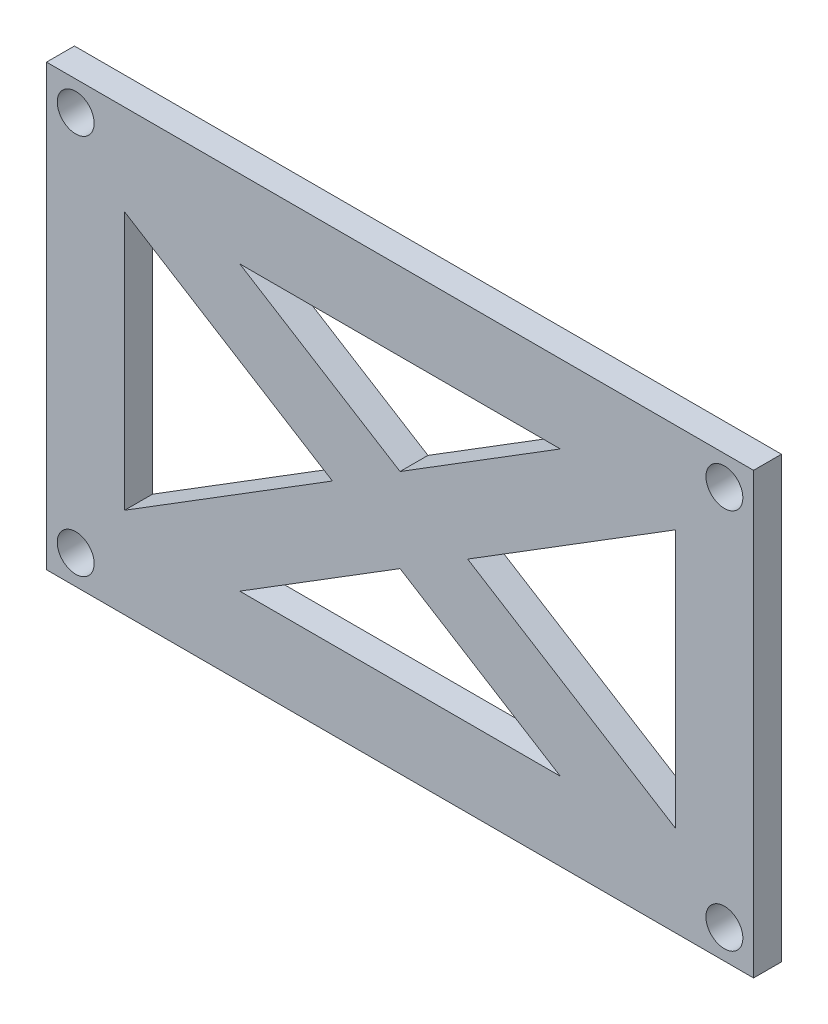
ISO-10303-21;
HEADER;
FILE_DESCRIPTION(('STEP AP214'),'2;1');
FILE_NAME('part.step','',(''),(''),'','','');
FILE_SCHEMA(('AUTOMOTIVE_DESIGN { 1 0 10303 214 1 1 1 1 }'));
ENDSEC;
DATA;
#1=APPLICATION_CONTEXT('core data for automotive mechanical design processes');
#2=APPLICATION_PROTOCOL_DEFINITION('international standard','automotive_design',2000,#1);
#3=PRODUCT_CONTEXT('',#1,'mechanical');
#4=PRODUCT('Part','Part','',(#3));
#5=PRODUCT_RELATED_PRODUCT_CATEGORY('part','',(#4));
#6=PRODUCT_DEFINITION_FORMATION('','',#4);
#7=PRODUCT_DEFINITION_CONTEXT('part definition',#1,'design');
#8=PRODUCT_DEFINITION('design','',#6,#7);
#9=PRODUCT_DEFINITION_SHAPE('','',#8);
#10=(LENGTH_UNIT() NAMED_UNIT(*) SI_UNIT(.MILLI.,.METRE.));
#11=(NAMED_UNIT(*) PLANE_ANGLE_UNIT() SI_UNIT($,.RADIAN.));
#12=(NAMED_UNIT(*) SI_UNIT($,.STERADIAN.) SOLID_ANGLE_UNIT());
#13=UNCERTAINTY_MEASURE_WITH_UNIT(LENGTH_MEASURE(1.E-05),#10,'distance_accuracy_value','');
#14=(GEOMETRIC_REPRESENTATION_CONTEXT(3) GLOBAL_UNCERTAINTY_ASSIGNED_CONTEXT((#13)) GLOBAL_UNIT_ASSIGNED_CONTEXT((#10,
#11,#12)) REPRESENTATION_CONTEXT('',''));
#15=CARTESIAN_POINT('',(0.,0.,0.));
#16=DIRECTION('',(0.,0.,1.));
#17=DIRECTION('',(1.,0.,0.));
#18=AXIS2_PLACEMENT_3D('',#15,#16,#17);
#19=CARTESIAN_POINT('',(-20.1168,-12.5095,1.5875));
#20=DIRECTION('',(0.,0.,-1.));
#21=DIRECTION('',(-1.,0.,0.));
#22=AXIS2_PLACEMENT_3D('',#19,#20,#21);
#23=PLANE('',#22);
#24=CARTESIAN_POINT('',(18.4568000000001,-10.8494999999998,1.5875));
#25=DIRECTION('',(0.,0.,1.));
#26=DIRECTION('',(1.,0.,0.));
#27=AXIS2_PLACEMENT_3D('',#24,#25,#26);
#28=CIRCLE('',#27,1.05);
#29=CARTESIAN_POINT('',(19.5068000000001,-10.8494999999998,1.5875));
#30=VERTEX_POINT('',#29);
#31=EDGE_CURVE('E397',#30,#30,#28,.T.);
#32=ORIENTED_EDGE('',*,*,#31,.F.);
#33=EDGE_LOOP('',(#32));
#34=FACE_BOUND('',#33,.T.);
#35=CARTESIAN_POINT('',(-18.4568,10.8495,1.5875));
#36=DIRECTION('',(0.,0.,1.));
#37=DIRECTION('',(1.,0.,0.));
#38=AXIS2_PLACEMENT_3D('',#35,#36,#37);
#39=CIRCLE('',#38,1.05);
#40=CARTESIAN_POINT('',(-17.4068,10.8495,1.5875));
#41=VERTEX_POINT('',#40);
#42=EDGE_CURVE('E169',#41,#41,#39,.T.);
#43=ORIENTED_EDGE('',*,*,#42,.F.);
#44=EDGE_LOOP('',(#43));
#45=FACE_BOUND('',#44,.T.);
#46=DIRECTION('',(1.,0.,0.));
#47=VECTOR('',#46,1.);
#48=CARTESIAN_POINT('',(9.12072361857965,-8.06450000000001,1.5875));
#49=LINE('',#48,#47);
#50=CARTESIAN_POINT('',(-9.12072361857965,-8.06450000000001,1.5875));
#51=VERTEX_POINT('',#50);
#52=CARTESIAN_POINT('',(9.12072361857965,-8.06450000000001,1.5875));
#53=VERTEX_POINT('',#52);
#54=EDGE_CURVE('E175',#51,#53,#49,.T.);
#55=ORIENTED_EDGE('',*,*,#54,.F.);
#56=DIRECTION('',(-0.849200858476322,-0.528069978282309,0.));
#57=VECTOR('',#56,1.);
#58=CARTESIAN_POINT('',(0.,-2.39283790132516,1.5875));
#59=LINE('',#58,#57);
#60=CARTESIAN_POINT('',(0.,-2.39283790132516,1.5875));
#61=VERTEX_POINT('',#60);
#62=EDGE_CURVE('E181',#61,#51,#59,.T.);
#63=ORIENTED_EDGE('',*,*,#62,.F.);
#64=DIRECTION('',(-0.849200858476322,0.528069978282309,0.));
#65=VECTOR('',#64,1.);
#66=CARTESIAN_POINT('',(9.12072361857965,-8.06450000000001,1.5875));
#67=LINE('',#66,#65);
#68=EDGE_CURVE('E177',#53,#61,#67,.T.);
#69=ORIENTED_EDGE('',*,*,#68,.F.);
#70=EDGE_LOOP('',(#55,#63,#69));
#71=FACE_BOUND('',#70,.T.);
#72=DIRECTION('',(0.849200858476322,-0.528069978282309,0.));
#73=VECTOR('',#72,1.);
#74=CARTESIAN_POINT('',(0.,2.39283790132515,1.5875));
#75=LINE('',#74,#73);
#76=CARTESIAN_POINT('',(-9.12072361857966,8.06449999999999,1.5875));
#77=VERTEX_POINT('',#76);
#78=CARTESIAN_POINT('',(0.,2.39283790132515,1.5875));
#79=VERTEX_POINT('',#78);
#80=EDGE_CURVE('E223',#77,#79,#75,.T.);
#81=ORIENTED_EDGE('',*,*,#80,.F.);
#82=DIRECTION('',(-1.,0.,0.));
#83=VECTOR('',#82,1.);
#84=CARTESIAN_POINT('',(9.12072361857965,8.0645,1.5875));
#85=LINE('',#84,#83);
#86=CARTESIAN_POINT('',(9.12072361857965,8.0645,1.5875));
#87=VERTEX_POINT('',#86);
#88=EDGE_CURVE('E229',#87,#77,#85,.T.);
#89=ORIENTED_EDGE('',*,*,#88,.F.);
#90=DIRECTION('',(0.849200858476322,0.528069978282309,0.));
#91=VECTOR('',#90,1.);
#92=CARTESIAN_POINT('',(9.12072361857965,8.0645,1.5875));
#93=LINE('',#92,#91);
#94=EDGE_CURVE('E225',#79,#87,#93,.T.);
#95=ORIENTED_EDGE('',*,*,#94,.F.);
#96=EDGE_LOOP('',(#81,#89,#95));
#97=FACE_BOUND('',#96,.T.);
#98=DIRECTION('',(0.,-1.,0.));
#99=VECTOR('',#98,1.);
#100=CARTESIAN_POINT('',(-20.1168,12.5095,1.5875));
#101=LINE('',#100,#99);
#102=CARTESIAN_POINT('',(-20.1168,12.5095,1.5875));
#103=VERTEX_POINT('',#102);
#104=CARTESIAN_POINT('',(-20.1168,-12.5095,1.5875));
#105=VERTEX_POINT('',#104);
#106=EDGE_CURVE('E247',#103,#105,#101,.T.);
#107=ORIENTED_EDGE('',*,*,#106,.T.);
#108=DIRECTION('',(1.,0.,0.));
#109=VECTOR('',#108,1.);
#110=CARTESIAN_POINT('',(20.1168,-12.5095,1.5875));
#111=LINE('',#110,#109);
#112=CARTESIAN_POINT('',(20.1168,-12.5095,1.5875));
#113=VERTEX_POINT('',#112);
#114=EDGE_CURVE('E250',#105,#113,#111,.T.);
#115=ORIENTED_EDGE('',*,*,#114,.T.);
#116=DIRECTION('',(0.,1.,0.));
#117=VECTOR('',#116,1.);
#118=CARTESIAN_POINT('',(20.1168,12.5095,1.5875));
#119=LINE('',#118,#117);
#120=CARTESIAN_POINT('',(20.1168,12.5095,1.5875));
#121=VERTEX_POINT('',#120);
#122=EDGE_CURVE('E253',#113,#121,#119,.T.);
#123=ORIENTED_EDGE('',*,*,#122,.T.);
#124=DIRECTION('',(-1.,0.,0.));
#125=VECTOR('',#124,1.);
#126=CARTESIAN_POINT('',(20.1168,12.5095,1.5875));
#127=LINE('',#126,#125);
#128=EDGE_CURVE('E255',#121,#103,#127,.T.);
#129=ORIENTED_EDGE('',*,*,#128,.T.);
#130=EDGE_LOOP('',(#107,#115,#123,#129));
#131=FACE_BOUND('',#130,.T.);
#132=DIRECTION('',(-0.849200858476322,0.528069978282308,0.));
#133=VECTOR('',#132,1.);
#134=CARTESIAN_POINT('',(-3.84797485857771,0.,1.5875));
#135=LINE('',#134,#133);
#136=CARTESIAN_POINT('',(-3.84797485857771,0.,1.5875));
#137=VERTEX_POINT('',#136);
#138=CARTESIAN_POINT('',(-15.6718,7.35256803301827,1.5875));
#139=VERTEX_POINT('',#138);
#140=EDGE_CURVE('E199',#137,#139,#135,.T.);
#141=ORIENTED_EDGE('',*,*,#140,.F.);
#142=DIRECTION('',(0.849200858476322,0.528069978282309,0.));
#143=VECTOR('',#142,1.);
#144=CARTESIAN_POINT('',(-3.84797485857771,0.,1.5875));
#145=LINE('',#144,#143);
#146=CARTESIAN_POINT('',(-15.6718,-7.35256803301829,1.5875));
#147=VERTEX_POINT('',#146);
#148=EDGE_CURVE('E205',#147,#137,#145,.T.);
#149=ORIENTED_EDGE('',*,*,#148,.F.);
#150=DIRECTION('',(0.,-1.,0.));
#151=VECTOR('',#150,1.);
#152=CARTESIAN_POINT('',(-15.6718,7.35256803301827,1.5875));
#153=LINE('',#152,#151);
#154=EDGE_CURVE('E201',#139,#147,#153,.T.);
#155=ORIENTED_EDGE('',*,*,#154,.F.);
#156=EDGE_LOOP('',(#141,#149,#155));
#157=FACE_BOUND('',#156,.T.);
#158=DIRECTION('',(0.,1.,0.));
#159=VECTOR('',#158,1.);
#160=CARTESIAN_POINT('',(15.6718,7.35256803301828,1.5875));
#161=LINE('',#160,#159);
#162=CARTESIAN_POINT('',(15.6718,-7.35256803301829,1.5875));
#163=VERTEX_POINT('',#162);
#164=CARTESIAN_POINT('',(15.6718,7.35256803301828,1.5875));
#165=VERTEX_POINT('',#164);
#166=EDGE_CURVE('E145',#163,#165,#161,.T.);
#167=ORIENTED_EDGE('',*,*,#166,.F.);
#168=DIRECTION('',(0.849200858476322,-0.528069978282308,0.));
#169=VECTOR('',#168,1.);
#170=CARTESIAN_POINT('',(15.6718,-7.35256803301829,1.5875));
#171=LINE('',#170,#169);
#172=CARTESIAN_POINT('',(3.84797485857771,0.,1.5875));
#173=VERTEX_POINT('',#172);
#174=EDGE_CURVE('E163',#173,#163,#171,.T.);
#175=ORIENTED_EDGE('',*,*,#174,.F.);
#176=DIRECTION('',(-0.849200858476322,-0.528069978282309,0.));
#177=VECTOR('',#176,1.);
#178=CARTESIAN_POINT('',(15.6718,7.35256803301828,1.5875));
#179=LINE('',#178,#177);
#180=EDGE_CURVE('E153',#165,#173,#179,.T.);
#181=ORIENTED_EDGE('',*,*,#180,.F.);
#182=EDGE_LOOP('',(#167,#175,#181));
#183=FACE_BOUND('',#182,.T.);
#184=CARTESIAN_POINT('',(-18.4568,-10.8495,1.5875));
#185=DIRECTION('',(0.,0.,1.));
#186=DIRECTION('',(-1.,0.,0.));
#187=AXIS2_PLACEMENT_3D('',#184,#185,#186);
#188=CIRCLE('',#187,1.05);
#189=CARTESIAN_POINT('',(-19.5068,-10.8495,1.5875));
#190=VERTEX_POINT('',#189);
#191=EDGE_CURVE('E403',#190,#190,#188,.T.);
#192=ORIENTED_EDGE('',*,*,#191,.F.);
#193=EDGE_LOOP('',(#192));
#194=FACE_BOUND('',#193,.T.);
#195=CARTESIAN_POINT('',(18.4567999999999,10.8495,1.5875));
#196=DIRECTION('',(0.,0.,1.));
#197=DIRECTION('',(-1.,0.,0.));
#198=AXIS2_PLACEMENT_3D('',#195,#196,#197);
#199=CIRCLE('',#198,1.05000000000001);
#200=CARTESIAN_POINT('',(17.4067999999999,10.8495,1.5875));
#201=VERTEX_POINT('',#200);
#202=EDGE_CURVE('E388',#201,#201,#199,.T.);
#203=ORIENTED_EDGE('',*,*,#202,.F.);
#204=EDGE_LOOP('',(#203));
#205=FACE_BOUND('',#204,.T.);
#206=ADVANCED_FACE('F32',(#34,#45,#71,#97,#131,#157,#183,#194,#205),#23,.F.);
#207=CARTESIAN_POINT('',(-20.1168,-12.5095,0.));
#208=DIRECTION('',(0.,0.,-1.));
#209=DIRECTION('',(-1.,0.,0.));
#210=AXIS2_PLACEMENT_3D('',#207,#208,#209);
#211=PLANE('',#210);
#212=CARTESIAN_POINT('',(18.4568000000001,-10.8494999999998,0.));
#213=DIRECTION('',(0.,0.,1.));
#214=DIRECTION('',(1.,0.,0.));
#215=AXIS2_PLACEMENT_3D('',#212,#213,#214);
#216=CIRCLE('',#215,1.05);
#217=CARTESIAN_POINT('',(19.5068000000001,-10.8494999999998,0.));
#218=VERTEX_POINT('',#217);
#219=EDGE_CURVE('E394',#218,#218,#216,.T.);
#220=ORIENTED_EDGE('',*,*,#219,.T.);
#221=EDGE_LOOP('',(#220));
#222=FACE_BOUND('',#221,.T.);
#223=CARTESIAN_POINT('',(-18.4568,10.8495,0.));
#224=DIRECTION('',(0.,0.,1.));
#225=DIRECTION('',(1.,0.,0.));
#226=AXIS2_PLACEMENT_3D('',#223,#224,#225);
#227=CIRCLE('',#226,1.05);
#228=CARTESIAN_POINT('',(-17.4068,10.8495,0.));
#229=VERTEX_POINT('',#228);
#230=EDGE_CURVE('E406',#229,#229,#227,.T.);
#231=ORIENTED_EDGE('',*,*,#230,.T.);
#232=EDGE_LOOP('',(#231));
#233=FACE_BOUND('',#232,.T.);
#234=DIRECTION('',(-0.849200858476322,-0.528069978282309,0.));
#235=VECTOR('',#234,1.);
#236=CARTESIAN_POINT('',(0.,-2.39283790132516,0.));
#237=LINE('',#236,#235);
#238=CARTESIAN_POINT('',(0.,-2.39283790132516,0.));
#239=VERTEX_POINT('',#238);
#240=CARTESIAN_POINT('',(-9.12072361857965,-8.06450000000001,0.));
#241=VERTEX_POINT('',#240);
#242=EDGE_CURVE('E178',#239,#241,#237,.T.);
#243=ORIENTED_EDGE('',*,*,#242,.T.);
#244=DIRECTION('',(1.,0.,0.));
#245=VECTOR('',#244,1.);
#246=CARTESIAN_POINT('',(9.12072361857965,-8.06450000000001,0.));
#247=LINE('',#246,#245);
#248=CARTESIAN_POINT('',(9.12072361857965,-8.06450000000001,0.));
#249=VERTEX_POINT('',#248);
#250=EDGE_CURVE('E160',#241,#249,#247,.T.);
#251=ORIENTED_EDGE('',*,*,#250,.T.);
#252=DIRECTION('',(-0.849200858476322,0.528069978282309,0.));
#253=VECTOR('',#252,1.);
#254=CARTESIAN_POINT('',(9.12072361857965,-8.06450000000001,0.));
#255=LINE('',#254,#253);
#256=EDGE_CURVE('E186',#249,#239,#255,.T.);
#257=ORIENTED_EDGE('',*,*,#256,.T.);
#258=EDGE_LOOP('',(#243,#251,#257));
#259=FACE_BOUND('',#258,.T.);
#260=DIRECTION('',(-1.,0.,0.));
#261=VECTOR('',#260,1.);
#262=CARTESIAN_POINT('',(9.12072361857965,8.0645,0.));
#263=LINE('',#262,#261);
#264=CARTESIAN_POINT('',(9.12072361857965,8.0645,0.));
#265=VERTEX_POINT('',#264);
#266=CARTESIAN_POINT('',(-9.12072361857966,8.0645,0.));
#267=VERTEX_POINT('',#266);
#268=EDGE_CURVE('E226',#265,#267,#263,.T.);
#269=ORIENTED_EDGE('',*,*,#268,.T.);
#270=DIRECTION('',(0.849200858476322,-0.528069978282309,0.));
#271=VECTOR('',#270,1.);
#272=CARTESIAN_POINT('',(0.,2.39283790132515,0.));
#273=LINE('',#272,#271);
#274=CARTESIAN_POINT('',(0.,2.39283790132515,0.));
#275=VERTEX_POINT('',#274);
#276=EDGE_CURVE('E222',#267,#275,#273,.T.);
#277=ORIENTED_EDGE('',*,*,#276,.T.);
#278=DIRECTION('',(0.849200858476322,0.528069978282309,0.));
#279=VECTOR('',#278,1.);
#280=CARTESIAN_POINT('',(9.12072361857965,8.0645,0.));
#281=LINE('',#280,#279);
#282=EDGE_CURVE('E234',#275,#265,#281,.T.);
#283=ORIENTED_EDGE('',*,*,#282,.T.);
#284=EDGE_LOOP('',(#269,#277,#283));
#285=FACE_BOUND('',#284,.T.);
#286=DIRECTION('',(0.,-1.,0.));
#287=VECTOR('',#286,1.);
#288=CARTESIAN_POINT('',(-20.1168,12.5095,0.));
#289=LINE('',#288,#287);
#290=CARTESIAN_POINT('',(-20.1168,12.5095,0.));
#291=VERTEX_POINT('',#290);
#292=CARTESIAN_POINT('',(-20.1168,-12.5095,0.));
#293=VERTEX_POINT('',#292);
#294=EDGE_CURVE('E246',#291,#293,#289,.T.);
#295=ORIENTED_EDGE('',*,*,#294,.F.);
#296=DIRECTION('',(-1.,0.,0.));
#297=VECTOR('',#296,1.);
#298=CARTESIAN_POINT('',(20.1168,12.5095,0.));
#299=LINE('',#298,#297);
#300=CARTESIAN_POINT('',(20.1168,12.5095,0.));
#301=VERTEX_POINT('',#300);
#302=EDGE_CURVE('E251',#301,#291,#299,.T.);
#303=ORIENTED_EDGE('',*,*,#302,.F.);
#304=DIRECTION('',(0.,1.,0.));
#305=VECTOR('',#304,1.);
#306=CARTESIAN_POINT('',(20.1168,12.5095,0.));
#307=LINE('',#306,#305);
#308=CARTESIAN_POINT('',(20.1168,-12.5095,0.));
#309=VERTEX_POINT('',#308);
#310=EDGE_CURVE('E262',#309,#301,#307,.T.);
#311=ORIENTED_EDGE('',*,*,#310,.F.);
#312=DIRECTION('',(1.,0.,0.));
#313=VECTOR('',#312,1.);
#314=CARTESIAN_POINT('',(20.1168,-12.5095,0.));
#315=LINE('',#314,#313);
#316=EDGE_CURVE('E260',#293,#309,#315,.T.);
#317=ORIENTED_EDGE('',*,*,#316,.F.);
#318=EDGE_LOOP('',(#295,#303,#311,#317));
#319=FACE_BOUND('',#318,.T.);
#320=DIRECTION('',(0.849200858476322,0.528069978282309,0.));
#321=VECTOR('',#320,1.);
#322=CARTESIAN_POINT('',(-3.84797485857771,0.,0.));
#323=LINE('',#322,#321);
#324=CARTESIAN_POINT('',(-15.6718,-7.35256803301829,0.));
#325=VERTEX_POINT('',#324);
#326=CARTESIAN_POINT('',(-3.84797485857771,0.,0.));
#327=VERTEX_POINT('',#326);
#328=EDGE_CURVE('E202',#325,#327,#323,.T.);
#329=ORIENTED_EDGE('',*,*,#328,.T.);
#330=DIRECTION('',(-0.849200858476322,0.528069978282308,0.));
#331=VECTOR('',#330,1.);
#332=CARTESIAN_POINT('',(-3.84797485857771,0.,0.));
#333=LINE('',#332,#331);
#334=CARTESIAN_POINT('',(-15.6718,7.35256803301827,0.));
#335=VERTEX_POINT('',#334);
#336=EDGE_CURVE('E198',#327,#335,#333,.T.);
#337=ORIENTED_EDGE('',*,*,#336,.T.);
#338=DIRECTION('',(0.,-1.,0.));
#339=VECTOR('',#338,1.);
#340=CARTESIAN_POINT('',(-15.6718,7.35256803301827,0.));
#341=LINE('',#340,#339);
#342=EDGE_CURVE('E210',#335,#325,#341,.T.);
#343=ORIENTED_EDGE('',*,*,#342,.T.);
#344=EDGE_LOOP('',(#329,#337,#343));
#345=FACE_BOUND('',#344,.T.);
#346=DIRECTION('',(0.849200858476322,-0.528069978282308,0.));
#347=VECTOR('',#346,1.);
#348=CARTESIAN_POINT('',(15.6718,-7.35256803301829,0.));
#349=LINE('',#348,#347);
#350=CARTESIAN_POINT('',(3.84797485857771,0.,0.));
#351=VERTEX_POINT('',#350);
#352=CARTESIAN_POINT('',(15.6718,-7.35256803301828,0.));
#353=VERTEX_POINT('',#352);
#354=EDGE_CURVE('E154',#351,#353,#349,.T.);
#355=ORIENTED_EDGE('',*,*,#354,.T.);
#356=DIRECTION('',(0.,1.,0.));
#357=VECTOR('',#356,1.);
#358=CARTESIAN_POINT('',(15.6718,7.35256803301828,0.));
#359=LINE('',#358,#357);
#360=CARTESIAN_POINT('',(15.6718,7.35256803301828,0.));
#361=VERTEX_POINT('',#360);
#362=EDGE_CURVE('E55',#353,#361,#359,.T.);
#363=ORIENTED_EDGE('',*,*,#362,.T.);
#364=DIRECTION('',(-0.849200858476322,-0.528069978282309,0.));
#365=VECTOR('',#364,1.);
#366=CARTESIAN_POINT('',(15.6718,7.35256803301828,0.));
#367=LINE('',#366,#365);
#368=EDGE_CURVE('E159',#361,#351,#367,.T.);
#369=ORIENTED_EDGE('',*,*,#368,.T.);
#370=EDGE_LOOP('',(#355,#363,#369));
#371=FACE_BOUND('',#370,.T.);
#372=CARTESIAN_POINT('',(-18.4568,-10.8495,0.));
#373=DIRECTION('',(0.,0.,1.));
#374=DIRECTION('',(-1.,0.,0.));
#375=AXIS2_PLACEMENT_3D('',#372,#373,#374);
#376=CIRCLE('',#375,1.05);
#377=CARTESIAN_POINT('',(-19.5068,-10.8495,0.));
#378=VERTEX_POINT('',#377);
#379=EDGE_CURVE('E400',#378,#378,#376,.T.);
#380=ORIENTED_EDGE('',*,*,#379,.T.);
#381=EDGE_LOOP('',(#380));
#382=FACE_BOUND('',#381,.T.);
#383=CARTESIAN_POINT('',(18.4567999999999,10.8495,0.));
#384=DIRECTION('',(0.,0.,1.));
#385=DIRECTION('',(-1.,0.,0.));
#386=AXIS2_PLACEMENT_3D('',#383,#384,#385);
#387=CIRCLE('',#386,1.05000000000001);
#388=CARTESIAN_POINT('',(17.4067999999999,10.8495,0.));
#389=VERTEX_POINT('',#388);
#390=EDGE_CURVE('E391',#389,#389,#387,.T.);
#391=ORIENTED_EDGE('',*,*,#390,.T.);
#392=EDGE_LOOP('',(#391));
#393=FACE_BOUND('',#392,.T.);
#394=ADVANCED_FACE('F280',(#222,#233,#259,#285,#319,#345,#371,#382,#393),#211,.T.);
#395=CARTESIAN_POINT('',(-20.1168,12.5095,1.5875));
#396=DIRECTION('',(1.,0.,0.));
#397=DIRECTION('',(0.,1.,0.));
#398=AXIS2_PLACEMENT_3D('',#395,#396,#397);
#399=PLANE('',#398);
#400=ORIENTED_EDGE('',*,*,#294,.T.);
#401=DIRECTION('',(0.,0.,-1.));
#402=VECTOR('',#401,1.);
#403=CARTESIAN_POINT('',(-20.1168,-12.5095,1.5875));
#404=LINE('',#403,#402);
#405=EDGE_CURVE('E11',#105,#293,#404,.T.);
#406=ORIENTED_EDGE('',*,*,#405,.F.);
#407=ORIENTED_EDGE('',*,*,#106,.F.);
#408=DIRECTION('',(0.,0.,-1.));
#409=VECTOR('',#408,1.);
#410=CARTESIAN_POINT('',(-20.1168,12.5095,1.5875));
#411=LINE('',#410,#409);
#412=EDGE_CURVE('E257',#103,#291,#411,.T.);
#413=ORIENTED_EDGE('',*,*,#412,.T.);
#414=EDGE_LOOP('',(#400,#406,#407,#413));
#415=FACE_BOUND('',#414,.T.);
#416=ADVANCED_FACE('F34',(#415),#399,.F.);
#417=CARTESIAN_POINT('',(20.1168,-12.5095,1.5875));
#418=DIRECTION('',(0.,1.,0.));
#419=DIRECTION('',(-1.,0.,0.));
#420=AXIS2_PLACEMENT_3D('',#417,#418,#419);
#421=PLANE('',#420);
#422=ORIENTED_EDGE('',*,*,#316,.T.);
#423=DIRECTION('',(0.,0.,-1.));
#424=VECTOR('',#423,1.);
#425=CARTESIAN_POINT('',(20.1168,-12.5095,1.5875));
#426=LINE('',#425,#424);
#427=EDGE_CURVE('E40',#113,#309,#426,.T.);
#428=ORIENTED_EDGE('',*,*,#427,.F.);
#429=ORIENTED_EDGE('',*,*,#114,.F.);
#430=ORIENTED_EDGE('',*,*,#405,.T.);
#431=EDGE_LOOP('',(#422,#428,#429,#430));
#432=FACE_BOUND('',#431,.T.);
#433=ADVANCED_FACE('F291',(#432),#421,.F.);
#434=CARTESIAN_POINT('',(20.1168,12.5095,1.5875));
#435=DIRECTION('',(-1.,0.,0.));
#436=DIRECTION('',(0.,-1.,0.));
#437=AXIS2_PLACEMENT_3D('',#434,#435,#436);
#438=PLANE('',#437);
#439=ORIENTED_EDGE('',*,*,#310,.T.);
#440=DIRECTION('',(0.,0.,-1.));
#441=VECTOR('',#440,1.);
#442=CARTESIAN_POINT('',(20.1168,12.5095,1.5875));
#443=LINE('',#442,#441);
#444=EDGE_CURVE('E267',#121,#301,#443,.T.);
#445=ORIENTED_EDGE('',*,*,#444,.F.);
#446=ORIENTED_EDGE('',*,*,#122,.F.);
#447=ORIENTED_EDGE('',*,*,#427,.T.);
#448=EDGE_LOOP('',(#439,#445,#446,#447));
#449=FACE_BOUND('',#448,.T.);
#450=ADVANCED_FACE('F274',(#449),#438,.F.);
#451=CARTESIAN_POINT('',(20.1168,12.5095,1.5875));
#452=DIRECTION('',(0.,-1.,0.));
#453=DIRECTION('',(1.,0.,0.));
#454=AXIS2_PLACEMENT_3D('',#451,#452,#453);
#455=PLANE('',#454);
#456=ORIENTED_EDGE('',*,*,#302,.T.);
#457=ORIENTED_EDGE('',*,*,#412,.F.);
#458=ORIENTED_EDGE('',*,*,#128,.F.);
#459=ORIENTED_EDGE('',*,*,#444,.T.);
#460=EDGE_LOOP('',(#456,#457,#458,#459));
#461=FACE_BOUND('',#460,.T.);
#462=ADVANCED_FACE('F284',(#461),#455,.F.);
#463=CARTESIAN_POINT('',(0.,2.39283790132515,1.5875));
#464=DIRECTION('',(0.528069978282309,0.849200858476322,0.));
#465=DIRECTION('',(-0.849200858476322,0.528069978282309,0.));
#466=AXIS2_PLACEMENT_3D('',#463,#464,#465);
#467=PLANE('',#466);
#468=ORIENTED_EDGE('',*,*,#276,.F.);
#469=DIRECTION('',(0.,0.,-1.));
#470=VECTOR('',#469,1.);
#471=CARTESIAN_POINT('',(-9.12072361857966,8.06449999999999,1.5875));
#472=LINE('',#471,#470);
#473=EDGE_CURVE('E231',#77,#267,#472,.T.);
#474=ORIENTED_EDGE('',*,*,#473,.F.);
#475=ORIENTED_EDGE('',*,*,#80,.T.);
#476=DIRECTION('',(0.,0.,-1.));
#477=VECTOR('',#476,1.);
#478=CARTESIAN_POINT('',(0.,2.39283790132515,1.5875));
#479=LINE('',#478,#477);
#480=EDGE_CURVE('E243',#79,#275,#479,.T.);
#481=ORIENTED_EDGE('',*,*,#480,.T.);
#482=EDGE_LOOP('',(#468,#474,#475,#481));
#483=FACE_BOUND('',#482,.T.);
#484=ADVANCED_FACE('F309',(#483),#467,.T.);
#485=CARTESIAN_POINT('',(9.12072361857965,8.0645,1.5875));
#486=DIRECTION('',(-0.528069978282309,0.849200858476322,0.));
#487=DIRECTION('',(-0.849200858476322,-0.528069978282309,0.));
#488=AXIS2_PLACEMENT_3D('',#485,#486,#487);
#489=PLANE('',#488);
#490=ORIENTED_EDGE('',*,*,#282,.F.);
#491=ORIENTED_EDGE('',*,*,#480,.F.);
#492=ORIENTED_EDGE('',*,*,#94,.T.);
#493=DIRECTION('',(0.,0.,-1.));
#494=VECTOR('',#493,1.);
#495=CARTESIAN_POINT('',(9.12072361857965,8.0645,1.5875));
#496=LINE('',#495,#494);
#497=EDGE_CURVE('E241',#87,#265,#496,.T.);
#498=ORIENTED_EDGE('',*,*,#497,.T.);
#499=EDGE_LOOP('',(#490,#491,#492,#498));
#500=FACE_BOUND('',#499,.T.);
#501=ADVANCED_FACE('F316',(#500),#489,.T.);
#502=CARTESIAN_POINT('',(9.12072361857965,8.0645,1.5875));
#503=DIRECTION('',(0.,-1.,0.));
#504=DIRECTION('',(1.,0.,0.));
#505=AXIS2_PLACEMENT_3D('',#502,#503,#504);
#506=PLANE('',#505);
#507=ORIENTED_EDGE('',*,*,#268,.F.);
#508=ORIENTED_EDGE('',*,*,#497,.F.);
#509=ORIENTED_EDGE('',*,*,#88,.T.);
#510=ORIENTED_EDGE('',*,*,#473,.T.);
#511=EDGE_LOOP('',(#507,#508,#509,#510));
#512=FACE_BOUND('',#511,.T.);
#513=ADVANCED_FACE('F321',(#512),#506,.T.);
#514=CARTESIAN_POINT('',(-3.84797485857771,0.,1.5875));
#515=DIRECTION('',(-0.528069978282308,-0.849200858476322,0.));
#516=DIRECTION('',(0.849200858476322,-0.528069978282308,0.));
#517=AXIS2_PLACEMENT_3D('',#514,#515,#516);
#518=PLANE('',#517);
#519=ORIENTED_EDGE('',*,*,#336,.F.);
#520=DIRECTION('',(0.,0.,-1.));
#521=VECTOR('',#520,1.);
#522=CARTESIAN_POINT('',(-3.84797485857771,0.,1.5875));
#523=LINE('',#522,#521);
#524=EDGE_CURVE('E207',#137,#327,#523,.T.);
#525=ORIENTED_EDGE('',*,*,#524,.F.);
#526=ORIENTED_EDGE('',*,*,#140,.T.);
#527=DIRECTION('',(0.,0.,-1.));
#528=VECTOR('',#527,1.);
#529=CARTESIAN_POINT('',(-15.6718,7.35256803301827,1.5875));
#530=LINE('',#529,#528);
#531=EDGE_CURVE('E219',#139,#335,#530,.T.);
#532=ORIENTED_EDGE('',*,*,#531,.T.);
#533=EDGE_LOOP('',(#519,#525,#526,#532));
#534=FACE_BOUND('',#533,.T.);
#535=ADVANCED_FACE('F333',(#534),#518,.T.);
#536=CARTESIAN_POINT('',(-15.6718,7.35256803301827,1.5875));
#537=DIRECTION('',(1.,0.,0.));
#538=DIRECTION('',(0.,1.,0.));
#539=AXIS2_PLACEMENT_3D('',#536,#537,#538);
#540=PLANE('',#539);
#541=ORIENTED_EDGE('',*,*,#342,.F.);
#542=ORIENTED_EDGE('',*,*,#531,.F.);
#543=ORIENTED_EDGE('',*,*,#154,.T.);
#544=DIRECTION('',(0.,0.,-1.));
#545=VECTOR('',#544,1.);
#546=CARTESIAN_POINT('',(-15.6718,-7.35256803301829,1.5875));
#547=LINE('',#546,#545);
#548=EDGE_CURVE('E217',#147,#325,#547,.T.);
#549=ORIENTED_EDGE('',*,*,#548,.T.);
#550=EDGE_LOOP('',(#541,#542,#543,#549));
#551=FACE_BOUND('',#550,.T.);
#552=ADVANCED_FACE('F338',(#551),#540,.T.);
#553=CARTESIAN_POINT('',(-3.84797485857771,0.,1.5875));
#554=DIRECTION('',(-0.528069978282309,0.849200858476322,0.));
#555=DIRECTION('',(-0.849200858476322,-0.528069978282309,0.));
#556=AXIS2_PLACEMENT_3D('',#553,#554,#555);
#557=PLANE('',#556);
#558=ORIENTED_EDGE('',*,*,#328,.F.);
#559=ORIENTED_EDGE('',*,*,#548,.F.);
#560=ORIENTED_EDGE('',*,*,#148,.T.);
#561=ORIENTED_EDGE('',*,*,#524,.T.);
#562=EDGE_LOOP('',(#558,#559,#560,#561));
#563=FACE_BOUND('',#562,.T.);
#564=ADVANCED_FACE('F344',(#563),#557,.T.);
#565=CARTESIAN_POINT('',(9.12072361857965,-8.06450000000001,1.5875));
#566=DIRECTION('',(0.,1.,0.));
#567=DIRECTION('',(-1.,0.,0.));
#568=AXIS2_PLACEMENT_3D('',#565,#566,#567);
#569=PLANE('',#568);
#570=ORIENTED_EDGE('',*,*,#250,.F.);
#571=DIRECTION('',(0.,0.,-1.));
#572=VECTOR('',#571,1.);
#573=CARTESIAN_POINT('',(-9.12072361857965,-8.06450000000001,1.5875));
#574=LINE('',#573,#572);
#575=EDGE_CURVE('E183',#51,#241,#574,.T.);
#576=ORIENTED_EDGE('',*,*,#575,.F.);
#577=ORIENTED_EDGE('',*,*,#54,.T.);
#578=DIRECTION('',(0.,0.,-1.));
#579=VECTOR('',#578,1.);
#580=CARTESIAN_POINT('',(9.12072361857965,-8.06450000000001,1.5875));
#581=LINE('',#580,#579);
#582=EDGE_CURVE('E195',#53,#249,#581,.T.);
#583=ORIENTED_EDGE('',*,*,#582,.T.);
#584=EDGE_LOOP('',(#570,#576,#577,#583));
#585=FACE_BOUND('',#584,.T.);
#586=ADVANCED_FACE('F348',(#585),#569,.T.);
#587=CARTESIAN_POINT('',(9.12072361857965,-8.06450000000001,1.5875));
#588=DIRECTION('',(-0.528069978282309,-0.849200858476322,0.));
#589=DIRECTION('',(0.849200858476322,-0.528069978282309,0.));
#590=AXIS2_PLACEMENT_3D('',#587,#588,#589);
#591=PLANE('',#590);
#592=ORIENTED_EDGE('',*,*,#256,.F.);
#593=ORIENTED_EDGE('',*,*,#582,.F.);
#594=ORIENTED_EDGE('',*,*,#68,.T.);
#595=DIRECTION('',(0.,0.,-1.));
#596=VECTOR('',#595,1.);
#597=CARTESIAN_POINT('',(0.,-2.39283790132516,1.5875));
#598=LINE('',#597,#596);
#599=EDGE_CURVE('E193',#61,#239,#598,.T.);
#600=ORIENTED_EDGE('',*,*,#599,.T.);
#601=EDGE_LOOP('',(#592,#593,#594,#600));
#602=FACE_BOUND('',#601,.T.);
#603=ADVANCED_FACE('F352',(#602),#591,.T.);
#604=CARTESIAN_POINT('',(0.,-2.39283790132516,1.5875));
#605=DIRECTION('',(0.528069978282309,-0.849200858476322,0.));
#606=DIRECTION('',(0.849200858476322,0.528069978282309,0.));
#607=AXIS2_PLACEMENT_3D('',#604,#605,#606);
#608=PLANE('',#607);
#609=ORIENTED_EDGE('',*,*,#242,.F.);
#610=ORIENTED_EDGE('',*,*,#599,.F.);
#611=ORIENTED_EDGE('',*,*,#62,.T.);
#612=ORIENTED_EDGE('',*,*,#575,.T.);
#613=EDGE_LOOP('',(#609,#610,#611,#612));
#614=FACE_BOUND('',#613,.T.);
#615=ADVANCED_FACE('F356',(#614),#608,.T.);
#616=CARTESIAN_POINT('',(15.6718,7.35256803301828,1.5875));
#617=DIRECTION('',(-1.,0.,0.));
#618=DIRECTION('',(0.,-1.,0.));
#619=AXIS2_PLACEMENT_3D('',#616,#617,#618);
#620=PLANE('',#619);
#621=ORIENTED_EDGE('',*,*,#362,.F.);
#622=DIRECTION('',(0.,0.,-1.));
#623=VECTOR('',#622,1.);
#624=CARTESIAN_POINT('',(15.6718,-7.35256803301829,1.5875));
#625=LINE('',#624,#623);
#626=EDGE_CURVE('E149',#163,#353,#625,.T.);
#627=ORIENTED_EDGE('',*,*,#626,.F.);
#628=ORIENTED_EDGE('',*,*,#166,.T.);
#629=DIRECTION('',(0.,0.,-1.));
#630=VECTOR('',#629,1.);
#631=CARTESIAN_POINT('',(15.6718,7.35256803301828,1.5875));
#632=LINE('',#631,#630);
#633=EDGE_CURVE('E148',#165,#361,#632,.T.);
#634=ORIENTED_EDGE('',*,*,#633,.T.);
#635=EDGE_LOOP('',(#621,#627,#628,#634));
#636=FACE_BOUND('',#635,.T.);
#637=ADVANCED_FACE('F147',(#636),#620,.T.);
#638=CARTESIAN_POINT('',(15.6718,7.35256803301828,1.5875));
#639=DIRECTION('',(0.528069978282309,-0.849200858476322,0.));
#640=DIRECTION('',(0.849200858476322,0.528069978282309,0.));
#641=AXIS2_PLACEMENT_3D('',#638,#639,#640);
#642=PLANE('',#641);
#643=ORIENTED_EDGE('',*,*,#368,.F.);
#644=ORIENTED_EDGE('',*,*,#633,.F.);
#645=ORIENTED_EDGE('',*,*,#180,.T.);
#646=DIRECTION('',(0.,0.,-1.));
#647=VECTOR('',#646,1.);
#648=CARTESIAN_POINT('',(3.84797485857771,0.,1.5875));
#649=LINE('',#648,#647);
#650=EDGE_CURVE('E47',#173,#351,#649,.T.);
#651=ORIENTED_EDGE('',*,*,#650,.T.);
#652=EDGE_LOOP('',(#643,#644,#645,#651));
#653=FACE_BOUND('',#652,.T.);
#654=ADVANCED_FACE('F157',(#653),#642,.T.);
#655=CARTESIAN_POINT('',(15.6718,-7.35256803301829,1.5875));
#656=DIRECTION('',(0.528069978282309,0.849200858476322,0.));
#657=DIRECTION('',(-0.849200858476322,0.528069978282309,0.));
#658=AXIS2_PLACEMENT_3D('',#655,#656,#657);
#659=PLANE('',#658);
#660=ORIENTED_EDGE('',*,*,#354,.F.);
#661=ORIENTED_EDGE('',*,*,#650,.F.);
#662=ORIENTED_EDGE('',*,*,#174,.T.);
#663=ORIENTED_EDGE('',*,*,#626,.T.);
#664=EDGE_LOOP('',(#660,#661,#662,#663));
#665=FACE_BOUND('',#664,.T.);
#666=ADVANCED_FACE('F365',(#665),#659,.T.);
#667=CARTESIAN_POINT('',(-18.4568,10.8495,1.5875));
#668=DIRECTION('',(0.,0.,-1.));
#669=DIRECTION('',(-1.,0.,0.));
#670=AXIS2_PLACEMENT_3D('',#667,#668,#669);
#671=CYLINDRICAL_SURFACE('',#670,1.05);
#672=ORIENTED_EDGE('',*,*,#42,.T.);
#673=EDGE_LOOP('',(#672));
#674=FACE_BOUND('',#673,.T.);
#675=ORIENTED_EDGE('',*,*,#230,.F.);
#676=EDGE_LOOP('',(#675));
#677=FACE_BOUND('',#676,.T.);
#678=ADVANCED_FACE('F368',(#674,#677),#671,.F.);
#679=CARTESIAN_POINT('',(-18.4568,-10.8495,1.5875));
#680=DIRECTION('',(0.,0.,-1.));
#681=DIRECTION('',(-1.,0.,0.));
#682=AXIS2_PLACEMENT_3D('',#679,#680,#681);
#683=CYLINDRICAL_SURFACE('',#682,1.05);
#684=ORIENTED_EDGE('',*,*,#191,.T.);
#685=EDGE_LOOP('',(#684));
#686=FACE_BOUND('',#685,.T.);
#687=ORIENTED_EDGE('',*,*,#379,.F.);
#688=EDGE_LOOP('',(#687));
#689=FACE_BOUND('',#688,.T.);
#690=ADVANCED_FACE('F371',(#686,#689),#683,.F.);
#691=CARTESIAN_POINT('',(18.4568000000001,-10.8494999999998,1.5875));
#692=DIRECTION('',(0.,0.,-1.));
#693=DIRECTION('',(-1.,0.,0.));
#694=AXIS2_PLACEMENT_3D('',#691,#692,#693);
#695=CYLINDRICAL_SURFACE('',#694,1.05);
#696=ORIENTED_EDGE('',*,*,#31,.T.);
#697=EDGE_LOOP('',(#696));
#698=FACE_BOUND('',#697,.T.);
#699=ORIENTED_EDGE('',*,*,#219,.F.);
#700=EDGE_LOOP('',(#699));
#701=FACE_BOUND('',#700,.T.);
#702=ADVANCED_FACE('F375',(#698,#701),#695,.F.);
#703=CARTESIAN_POINT('',(18.4567999999999,10.8495,1.5875));
#704=DIRECTION('',(0.,0.,-1.));
#705=DIRECTION('',(-1.,0.,0.));
#706=AXIS2_PLACEMENT_3D('',#703,#704,#705);
#707=CYLINDRICAL_SURFACE('',#706,1.05000000000001);
#708=ORIENTED_EDGE('',*,*,#202,.T.);
#709=EDGE_LOOP('',(#708));
#710=FACE_BOUND('',#709,.T.);
#711=ORIENTED_EDGE('',*,*,#390,.F.);
#712=EDGE_LOOP('',(#711));
#713=FACE_BOUND('',#712,.T.);
#714=ADVANCED_FACE('F379',(#710,#713),#707,.F.);
#715=CLOSED_SHELL('',(#206,#394,#416,#433,#450,#462,#484,#501,#513,#535,#552,#564,#586,#603,
#615,#637,#654,#666,#678,#690,#702,#714));
#716=MANIFOLD_SOLID_BREP('B2',#715);
#717=ADVANCED_BREP_SHAPE_REPRESENTATION('',(#18,#716),#14);
#718=SHAPE_DEFINITION_REPRESENTATION(#9,#717);
ENDSEC;
END-ISO-10303-21;
